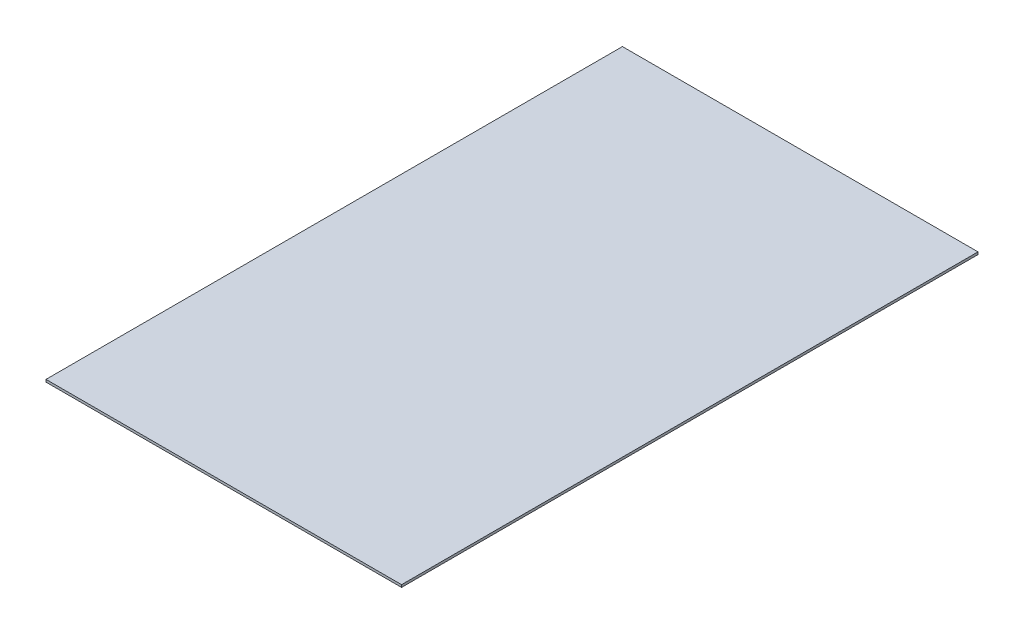
ISO-10303-21;
HEADER;
FILE_DESCRIPTION(('STEP AP214'),'2;1');
FILE_NAME('part.step','',(''),(''),'','','');
FILE_SCHEMA(('AUTOMOTIVE_DESIGN { 1 0 10303 214 1 1 1 1 }'));
ENDSEC;
DATA;
#1=APPLICATION_CONTEXT('core data for automotive mechanical design processes');
#2=APPLICATION_PROTOCOL_DEFINITION('international standard','automotive_design',2000,#1);
#3=PRODUCT_CONTEXT('',#1,'mechanical');
#4=PRODUCT('Part','Part','',(#3));
#5=PRODUCT_RELATED_PRODUCT_CATEGORY('part','',(#4));
#6=PRODUCT_DEFINITION_FORMATION('','',#4);
#7=PRODUCT_DEFINITION_CONTEXT('part definition',#1,'design');
#8=PRODUCT_DEFINITION('design','',#6,#7);
#9=PRODUCT_DEFINITION_SHAPE('','',#8);
#10=(LENGTH_UNIT() NAMED_UNIT(*) SI_UNIT(.MILLI.,.METRE.));
#11=(NAMED_UNIT(*) PLANE_ANGLE_UNIT() SI_UNIT($,.RADIAN.));
#12=(NAMED_UNIT(*) SI_UNIT($,.STERADIAN.) SOLID_ANGLE_UNIT());
#13=UNCERTAINTY_MEASURE_WITH_UNIT(LENGTH_MEASURE(1.E-05),#10,'distance_accuracy_value','');
#14=(GEOMETRIC_REPRESENTATION_CONTEXT(3) GLOBAL_UNCERTAINTY_ASSIGNED_CONTEXT((#13)) GLOBAL_UNIT_ASSIGNED_CONTEXT((#10,
#11,#12)) REPRESENTATION_CONTEXT('',''));
#15=CARTESIAN_POINT('',(0.,0.,0.));
#16=DIRECTION('',(0.,0.,1.));
#17=DIRECTION('',(1.,0.,0.));
#18=AXIS2_PLACEMENT_3D('',#15,#16,#17);
#19=CARTESIAN_POINT('',(162.6,2.2,-263.6));
#20=DIRECTION('',(-1.,0.,0.));
#21=DIRECTION('',(0.,0.,1.));
#22=AXIS2_PLACEMENT_3D('',#19,#20,#21);
#23=PLANE('',#22);
#24=DIRECTION('',(0.,0.,-1.));
#25=VECTOR('',#24,1.);
#26=CARTESIAN_POINT('',(162.6,0.,-263.6));
#27=LINE('',#26,#25);
#28=CARTESIAN_POINT('',(162.6,0.,263.6));
#29=VERTEX_POINT('',#28);
#30=CARTESIAN_POINT('',(162.6,0.,-263.6));
#31=VERTEX_POINT('',#30);
#32=EDGE_CURVE('E102',#29,#31,#27,.T.);
#33=ORIENTED_EDGE('',*,*,#32,.T.);
#34=DIRECTION('',(0.,-1.,0.));
#35=VECTOR('',#34,1.);
#36=CARTESIAN_POINT('',(162.6,2.2,-263.6));
#37=LINE('',#36,#35);
#38=CARTESIAN_POINT('',(162.6,2.2,-263.6));
#39=VERTEX_POINT('',#38);
#40=EDGE_CURVE('E11',#39,#31,#37,.T.);
#41=ORIENTED_EDGE('',*,*,#40,.F.);
#42=DIRECTION('',(0.,0.,-1.));
#43=VECTOR('',#42,1.);
#44=CARTESIAN_POINT('',(162.6,2.2,-263.6));
#45=LINE('',#44,#43);
#46=CARTESIAN_POINT('',(162.6,2.2,263.6));
#47=VERTEX_POINT('',#46);
#48=EDGE_CURVE('E90',#47,#39,#45,.T.);
#49=ORIENTED_EDGE('',*,*,#48,.F.);
#50=DIRECTION('',(0.,-1.,0.));
#51=VECTOR('',#50,1.);
#52=CARTESIAN_POINT('',(162.6,2.2,263.6));
#53=LINE('',#52,#51);
#54=EDGE_CURVE('E98',#47,#29,#53,.T.);
#55=ORIENTED_EDGE('',*,*,#54,.T.);
#56=EDGE_LOOP('',(#33,#41,#49,#55));
#57=FACE_BOUND('',#56,.T.);
#58=ADVANCED_FACE('F39',(#57),#23,.F.);
#59=CARTESIAN_POINT('',(-162.6,2.2,-263.6));
#60=DIRECTION('',(0.,0.,1.));
#61=DIRECTION('',(1.,0.,0.));
#62=AXIS2_PLACEMENT_3D('',#59,#60,#61);
#63=PLANE('',#62);
#64=DIRECTION('',(-1.,0.,0.));
#65=VECTOR('',#64,1.);
#66=CARTESIAN_POINT('',(-162.6,0.,-263.6));
#67=LINE('',#66,#65);
#68=CARTESIAN_POINT('',(-162.6,0.,-263.6));
#69=VERTEX_POINT('',#68);
#70=EDGE_CURVE('E94',#31,#69,#67,.T.);
#71=ORIENTED_EDGE('',*,*,#70,.T.);
#72=DIRECTION('',(0.,-1.,0.));
#73=VECTOR('',#72,1.);
#74=CARTESIAN_POINT('',(-162.6,2.2,-263.6));
#75=LINE('',#74,#73);
#76=CARTESIAN_POINT('',(-162.6,2.2,-263.6));
#77=VERTEX_POINT('',#76);
#78=EDGE_CURVE('E47',#77,#69,#75,.T.);
#79=ORIENTED_EDGE('',*,*,#78,.F.);
#80=DIRECTION('',(-1.,0.,0.));
#81=VECTOR('',#80,1.);
#82=CARTESIAN_POINT('',(-162.6,2.2,-263.6));
#83=LINE('',#82,#81);
#84=EDGE_CURVE('E85',#39,#77,#83,.T.);
#85=ORIENTED_EDGE('',*,*,#84,.F.);
#86=ORIENTED_EDGE('',*,*,#40,.T.);
#87=EDGE_LOOP('',(#71,#79,#85,#86));
#88=FACE_BOUND('',#87,.T.);
#89=ADVANCED_FACE('F93',(#88),#63,.F.);
#90=CARTESIAN_POINT('',(-162.6,2.2,-263.6));
#91=DIRECTION('',(1.,0.,0.));
#92=DIRECTION('',(0.,0.,-1.));
#93=AXIS2_PLACEMENT_3D('',#90,#91,#92);
#94=PLANE('',#93);
#95=DIRECTION('',(0.,0.,1.));
#96=VECTOR('',#95,1.);
#97=CARTESIAN_POINT('',(-162.6,0.,-263.6));
#98=LINE('',#97,#96);
#99=CARTESIAN_POINT('',(-162.6,0.,263.6));
#100=VERTEX_POINT('',#99);
#101=EDGE_CURVE('E72',#69,#100,#98,.T.);
#102=ORIENTED_EDGE('',*,*,#101,.T.);
#103=DIRECTION('',(0.,-1.,0.));
#104=VECTOR('',#103,1.);
#105=CARTESIAN_POINT('',(-162.6,2.2,263.6));
#106=LINE('',#105,#104);
#107=CARTESIAN_POINT('',(-162.6,2.2,263.6));
#108=VERTEX_POINT('',#107);
#109=EDGE_CURVE('E95',#108,#100,#106,.T.);
#110=ORIENTED_EDGE('',*,*,#109,.F.);
#111=DIRECTION('',(0.,0.,1.));
#112=VECTOR('',#111,1.);
#113=CARTESIAN_POINT('',(-162.6,2.2,-263.6));
#114=LINE('',#113,#112);
#115=EDGE_CURVE('E88',#77,#108,#114,.T.);
#116=ORIENTED_EDGE('',*,*,#115,.F.);
#117=ORIENTED_EDGE('',*,*,#78,.T.);
#118=EDGE_LOOP('',(#102,#110,#116,#117));
#119=FACE_BOUND('',#118,.T.);
#120=ADVANCED_FACE('F96',(#119),#94,.F.);
#121=CARTESIAN_POINT('',(-162.6,2.2,263.6));
#122=DIRECTION('',(0.,0.,-1.));
#123=DIRECTION('',(-1.,0.,0.));
#124=AXIS2_PLACEMENT_3D('',#121,#122,#123);
#125=PLANE('',#124);
#126=DIRECTION('',(1.,0.,0.));
#127=VECTOR('',#126,1.);
#128=CARTESIAN_POINT('',(-162.6,0.,263.6));
#129=LINE('',#128,#127);
#130=EDGE_CURVE('E78',#100,#29,#129,.T.);
#131=ORIENTED_EDGE('',*,*,#130,.T.);
#132=ORIENTED_EDGE('',*,*,#54,.F.);
#133=DIRECTION('',(1.,0.,0.));
#134=VECTOR('',#133,1.);
#135=CARTESIAN_POINT('',(-162.6,2.2,263.6));
#136=LINE('',#135,#134);
#137=EDGE_CURVE('E55',#108,#47,#136,.T.);
#138=ORIENTED_EDGE('',*,*,#137,.F.);
#139=ORIENTED_EDGE('',*,*,#109,.T.);
#140=EDGE_LOOP('',(#131,#132,#138,#139));
#141=FACE_BOUND('',#140,.T.);
#142=ADVANCED_FACE('F109',(#141),#125,.F.);
#143=CARTESIAN_POINT('',(0.,2.2,0.));
#144=DIRECTION('',(0.,1.,0.));
#145=DIRECTION('',(0.,0.,1.));
#146=AXIS2_PLACEMENT_3D('',#143,#144,#145);
#147=PLANE('',#146);
#148=ORIENTED_EDGE('',*,*,#48,.T.);
#149=ORIENTED_EDGE('',*,*,#84,.T.);
#150=ORIENTED_EDGE('',*,*,#115,.T.);
#151=ORIENTED_EDGE('',*,*,#137,.T.);
#152=EDGE_LOOP('',(#148,#149,#150,#151));
#153=FACE_BOUND('',#152,.T.);
#154=ADVANCED_FACE('F86',(#153),#147,.T.);
#155=CARTESIAN_POINT('',(0.,0.,0.));
#156=DIRECTION('',(0.,1.,0.));
#157=DIRECTION('',(0.,0.,1.));
#158=AXIS2_PLACEMENT_3D('',#155,#156,#157);
#159=PLANE('',#158);
#160=ORIENTED_EDGE('',*,*,#32,.F.);
#161=ORIENTED_EDGE('',*,*,#130,.F.);
#162=ORIENTED_EDGE('',*,*,#101,.F.);
#163=ORIENTED_EDGE('',*,*,#70,.F.);
#164=EDGE_LOOP('',(#160,#161,#162,#163));
#165=FACE_BOUND('',#164,.T.);
#166=ADVANCED_FACE('F112',(#165),#159,.F.);
#167=CLOSED_SHELL('',(#58,#89,#120,#142,#154,#166));
#168=MANIFOLD_SOLID_BREP('B2',#167);
#169=ADVANCED_BREP_SHAPE_REPRESENTATION('',(#18,#168),#14);
#170=SHAPE_DEFINITION_REPRESENTATION(#9,#169);
ENDSEC;
END-ISO-10303-21;
